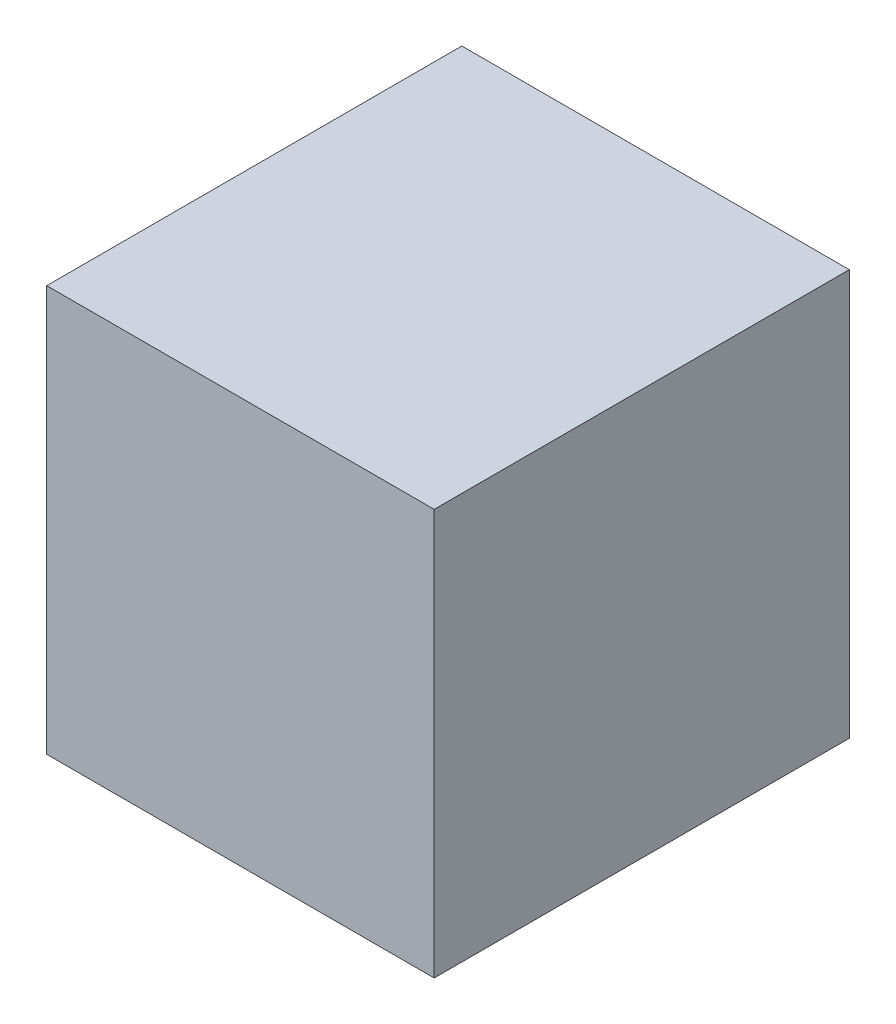
ISO-10303-21;
HEADER;
FILE_DESCRIPTION(('STEP AP214'),'2;1');
FILE_NAME('part.step','',(''),(''),'','','');
FILE_SCHEMA(('AUTOMOTIVE_DESIGN { 1 0 10303 214 1 1 1 1 }'));
ENDSEC;
DATA;
#1=APPLICATION_CONTEXT('core data for automotive mechanical design processes');
#2=APPLICATION_PROTOCOL_DEFINITION('international standard','automotive_design',2000,#1);
#3=PRODUCT_CONTEXT('',#1,'mechanical');
#4=PRODUCT('Part','Part','',(#3));
#5=PRODUCT_RELATED_PRODUCT_CATEGORY('part','',(#4));
#6=PRODUCT_DEFINITION_FORMATION('','',#4);
#7=PRODUCT_DEFINITION_CONTEXT('part definition',#1,'design');
#8=PRODUCT_DEFINITION('design','',#6,#7);
#9=PRODUCT_DEFINITION_SHAPE('','',#8);
#10=(LENGTH_UNIT() NAMED_UNIT(*) SI_UNIT(.MILLI.,.METRE.));
#11=(NAMED_UNIT(*) PLANE_ANGLE_UNIT() SI_UNIT($,.RADIAN.));
#12=(NAMED_UNIT(*) SI_UNIT($,.STERADIAN.) SOLID_ANGLE_UNIT());
#13=UNCERTAINTY_MEASURE_WITH_UNIT(LENGTH_MEASURE(1.E-05),#10,'distance_accuracy_value','');
#14=(GEOMETRIC_REPRESENTATION_CONTEXT(3) GLOBAL_UNCERTAINTY_ASSIGNED_CONTEXT((#13)) GLOBAL_UNIT_ASSIGNED_CONTEXT((#10,
#11,#12)) REPRESENTATION_CONTEXT('',''));
#15=CARTESIAN_POINT('',(0.,0.,0.));
#16=DIRECTION('',(0.,0.,1.));
#17=DIRECTION('',(1.,0.,0.));
#18=AXIS2_PLACEMENT_3D('',#15,#16,#17);
#19=CARTESIAN_POINT('',(-42.,88.,45.));
#20=DIRECTION('',(1.,0.,0.));
#21=DIRECTION('',(0.,0.,-1.));
#22=AXIS2_PLACEMENT_3D('',#19,#20,#21);
#23=PLANE('',#22);
#24=DIRECTION('',(0.,0.,1.));
#25=VECTOR('',#24,1.);
#26=CARTESIAN_POINT('',(-42.,0.,45.));
#27=LINE('',#26,#25);
#28=CARTESIAN_POINT('',(-42.,0.,-45.));
#29=VERTEX_POINT('',#28);
#30=CARTESIAN_POINT('',(-42.,0.,45.));
#31=VERTEX_POINT('',#30);
#32=EDGE_CURVE('E111',#29,#31,#27,.T.);
#33=ORIENTED_EDGE('',*,*,#32,.T.);
#34=DIRECTION('',(0.,-1.,0.));
#35=VECTOR('',#34,1.);
#36=CARTESIAN_POINT('',(-42.,88.,45.));
#37=LINE('',#36,#35);
#38=CARTESIAN_POINT('',(-42.,88.,45.));
#39=VERTEX_POINT('',#38);
#40=EDGE_CURVE('E11',#39,#31,#37,.T.);
#41=ORIENTED_EDGE('',*,*,#40,.F.);
#42=DIRECTION('',(0.,0.,1.));
#43=VECTOR('',#42,1.);
#44=CARTESIAN_POINT('',(-42.,88.,45.));
#45=LINE('',#44,#43);
#46=CARTESIAN_POINT('',(-42.,88.,-45.));
#47=VERTEX_POINT('',#46);
#48=EDGE_CURVE('E95',#47,#39,#45,.T.);
#49=ORIENTED_EDGE('',*,*,#48,.F.);
#50=DIRECTION('',(0.,-1.,0.));
#51=VECTOR('',#50,1.);
#52=CARTESIAN_POINT('',(-42.,88.,-45.));
#53=LINE('',#52,#51);
#54=EDGE_CURVE('E107',#47,#29,#53,.T.);
#55=ORIENTED_EDGE('',*,*,#54,.T.);
#56=EDGE_LOOP('',(#33,#41,#49,#55));
#57=FACE_BOUND('',#56,.T.);
#58=ADVANCED_FACE('F43',(#57),#23,.F.);
#59=CARTESIAN_POINT('',(42.,88.,45.));
#60=DIRECTION('',(0.,0.,-1.));
#61=DIRECTION('',(-1.,0.,0.));
#62=AXIS2_PLACEMENT_3D('',#59,#60,#61);
#63=PLANE('',#62);
#64=DIRECTION('',(1.,0.,0.));
#65=VECTOR('',#64,1.);
#66=CARTESIAN_POINT('',(42.,0.,45.));
#67=LINE('',#66,#65);
#68=CARTESIAN_POINT('',(42.,0.,45.));
#69=VERTEX_POINT('',#68);
#70=EDGE_CURVE('E100',#31,#69,#67,.T.);
#71=ORIENTED_EDGE('',*,*,#70,.T.);
#72=DIRECTION('',(0.,-1.,0.));
#73=VECTOR('',#72,1.);
#74=CARTESIAN_POINT('',(42.,88.,45.));
#75=LINE('',#74,#73);
#76=CARTESIAN_POINT('',(42.,88.,45.));
#77=VERTEX_POINT('',#76);
#78=EDGE_CURVE('E52',#77,#69,#75,.T.);
#79=ORIENTED_EDGE('',*,*,#78,.F.);
#80=DIRECTION('',(1.,0.,0.));
#81=VECTOR('',#80,1.);
#82=CARTESIAN_POINT('',(42.,88.,45.));
#83=LINE('',#82,#81);
#84=EDGE_CURVE('E90',#39,#77,#83,.T.);
#85=ORIENTED_EDGE('',*,*,#84,.F.);
#86=ORIENTED_EDGE('',*,*,#40,.T.);
#87=EDGE_LOOP('',(#71,#79,#85,#86));
#88=FACE_BOUND('',#87,.T.);
#89=ADVANCED_FACE('F99',(#88),#63,.F.);
#90=CARTESIAN_POINT('',(42.,88.,45.));
#91=DIRECTION('',(-1.,0.,0.));
#92=DIRECTION('',(0.,0.,1.));
#93=AXIS2_PLACEMENT_3D('',#90,#91,#92);
#94=PLANE('',#93);
#95=DIRECTION('',(0.,0.,-1.));
#96=VECTOR('',#95,1.);
#97=CARTESIAN_POINT('',(42.,0.,45.));
#98=LINE('',#97,#96);
#99=CARTESIAN_POINT('',(42.,0.,-45.));
#100=VERTEX_POINT('',#99);
#101=EDGE_CURVE('E77',#69,#100,#98,.T.);
#102=ORIENTED_EDGE('',*,*,#101,.T.);
#103=DIRECTION('',(0.,-1.,0.));
#104=VECTOR('',#103,1.);
#105=CARTESIAN_POINT('',(42.,88.,-45.));
#106=LINE('',#105,#104);
#107=CARTESIAN_POINT('',(42.,88.,-45.));
#108=VERTEX_POINT('',#107);
#109=EDGE_CURVE('E102',#108,#100,#106,.T.);
#110=ORIENTED_EDGE('',*,*,#109,.F.);
#111=DIRECTION('',(0.,0.,-1.));
#112=VECTOR('',#111,1.);
#113=CARTESIAN_POINT('',(42.,88.,45.));
#114=LINE('',#113,#112);
#115=EDGE_CURVE('E93',#77,#108,#114,.T.);
#116=ORIENTED_EDGE('',*,*,#115,.F.);
#117=ORIENTED_EDGE('',*,*,#78,.T.);
#118=EDGE_LOOP('',(#102,#110,#116,#117));
#119=FACE_BOUND('',#118,.T.);
#120=ADVANCED_FACE('F103',(#119),#94,.F.);
#121=CARTESIAN_POINT('',(42.,88.,-45.));
#122=DIRECTION('',(0.,0.,1.));
#123=DIRECTION('',(1.,0.,0.));
#124=AXIS2_PLACEMENT_3D('',#121,#122,#123);
#125=PLANE('',#124);
#126=DIRECTION('',(-1.,0.,0.));
#127=VECTOR('',#126,1.);
#128=CARTESIAN_POINT('',(42.,0.,-45.));
#129=LINE('',#128,#127);
#130=EDGE_CURVE('E83',#100,#29,#129,.T.);
#131=ORIENTED_EDGE('',*,*,#130,.T.);
#132=ORIENTED_EDGE('',*,*,#54,.F.);
#133=DIRECTION('',(-1.,0.,0.));
#134=VECTOR('',#133,1.);
#135=CARTESIAN_POINT('',(42.,88.,-45.));
#136=LINE('',#135,#134);
#137=EDGE_CURVE('E60',#108,#47,#136,.T.);
#138=ORIENTED_EDGE('',*,*,#137,.F.);
#139=ORIENTED_EDGE('',*,*,#109,.T.);
#140=EDGE_LOOP('',(#131,#132,#138,#139));
#141=FACE_BOUND('',#140,.T.);
#142=ADVANCED_FACE('F124',(#141),#125,.F.);
#143=CARTESIAN_POINT('',(0.,88.,0.));
#144=DIRECTION('',(0.,1.,0.));
#145=DIRECTION('',(0.,0.,1.));
#146=AXIS2_PLACEMENT_3D('',#143,#144,#145);
#147=PLANE('',#146);
#148=ORIENTED_EDGE('',*,*,#48,.T.);
#149=ORIENTED_EDGE('',*,*,#84,.T.);
#150=ORIENTED_EDGE('',*,*,#115,.T.);
#151=ORIENTED_EDGE('',*,*,#137,.T.);
#152=EDGE_LOOP('',(#148,#149,#150,#151));
#153=FACE_BOUND('',#152,.T.);
#154=ADVANCED_FACE('F91',(#153),#147,.T.);
#155=CARTESIAN_POINT('',(0.,0.,0.));
#156=DIRECTION('',(0.,1.,0.));
#157=DIRECTION('',(0.,0.,1.));
#158=AXIS2_PLACEMENT_3D('',#155,#156,#157);
#159=PLANE('',#158);
#160=ORIENTED_EDGE('',*,*,#32,.F.);
#161=ORIENTED_EDGE('',*,*,#130,.F.);
#162=ORIENTED_EDGE('',*,*,#101,.F.);
#163=ORIENTED_EDGE('',*,*,#70,.F.);
#164=EDGE_LOOP('',(#160,#161,#162,#163));
#165=FACE_BOUND('',#164,.T.);
#166=ADVANCED_FACE('F127',(#165),#159,.F.);
#167=CLOSED_SHELL('',(#58,#89,#120,#142,#154,#166));
#168=MANIFOLD_SOLID_BREP('B2',#167);
#169=ADVANCED_BREP_SHAPE_REPRESENTATION('',(#18,#168),#14);
#170=SHAPE_DEFINITION_REPRESENTATION(#9,#169);
ENDSEC;
END-ISO-10303-21;
